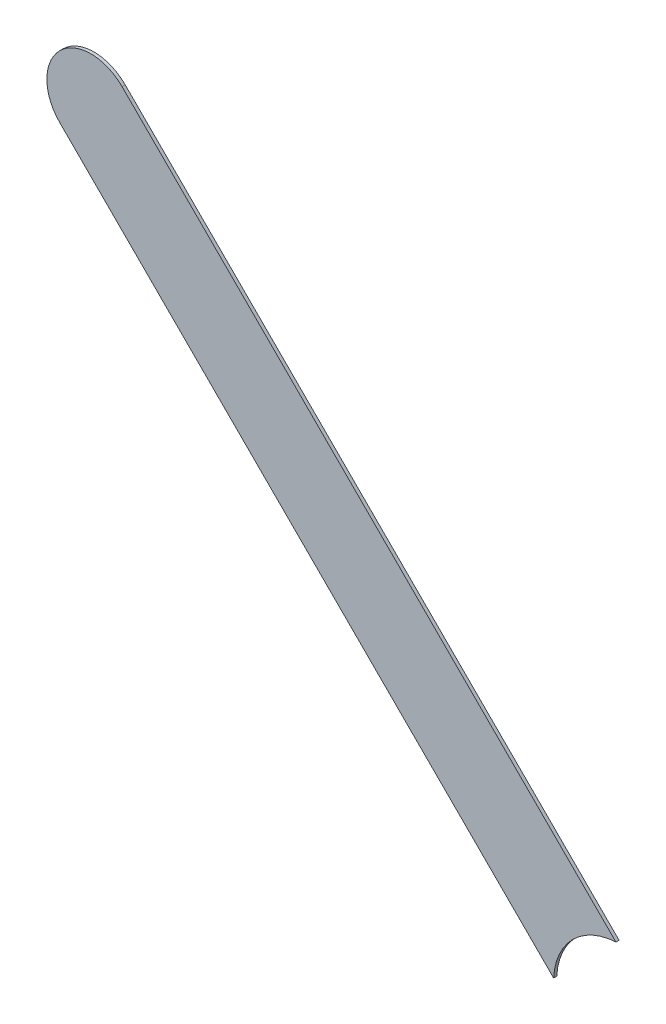
ISO-10303-21;
HEADER;
FILE_DESCRIPTION(('STEP AP214'),'2;1');
FILE_NAME('part.step','',(''),(''),'','','');
FILE_SCHEMA(('AUTOMOTIVE_DESIGN { 1 0 10303 214 1 1 1 1 }'));
ENDSEC;
DATA;
#1=APPLICATION_CONTEXT('core data for automotive mechanical design processes');
#2=APPLICATION_PROTOCOL_DEFINITION('international standard','automotive_design',2000,#1);
#3=PRODUCT_CONTEXT('',#1,'mechanical');
#4=PRODUCT('Part','Part','',(#3));
#5=PRODUCT_RELATED_PRODUCT_CATEGORY('part','',(#4));
#6=PRODUCT_DEFINITION_FORMATION('','',#4);
#7=PRODUCT_DEFINITION_CONTEXT('part definition',#1,'design');
#8=PRODUCT_DEFINITION('design','',#6,#7);
#9=PRODUCT_DEFINITION_SHAPE('','',#8);
#10=(LENGTH_UNIT() NAMED_UNIT(*) SI_UNIT(.MILLI.,.METRE.));
#11=(NAMED_UNIT(*) PLANE_ANGLE_UNIT() SI_UNIT($,.RADIAN.));
#12=(NAMED_UNIT(*) SI_UNIT($,.STERADIAN.) SOLID_ANGLE_UNIT());
#13=UNCERTAINTY_MEASURE_WITH_UNIT(LENGTH_MEASURE(1.E-05),#10,'distance_accuracy_value','');
#14=(GEOMETRIC_REPRESENTATION_CONTEXT(3) GLOBAL_UNCERTAINTY_ASSIGNED_CONTEXT((#13)) GLOBAL_UNIT_ASSIGNED_CONTEXT((#10,
#11,#12)) REPRESENTATION_CONTEXT('',''));
#15=CARTESIAN_POINT('',(0.,0.,0.));
#16=DIRECTION('',(0.,0.,1.));
#17=DIRECTION('',(1.,0.,0.));
#18=AXIS2_PLACEMENT_3D('',#15,#16,#17);
#19=CARTESIAN_POINT('',(71.46647124,48.14642644,0.));
#20=DIRECTION('',(0.707106781186548,0.707106781186548,0.));
#21=DIRECTION('',(0.707106781186548,-0.707106781186548,0.));
#22=AXIS2_PLACEMENT_3D('',#19,#20,#21);
#23=PLANE('',#22);
#24=DIRECTION('',(0.707106781186548,-0.707106781186548,0.));
#25=VECTOR('',#24,1.);
#26=CARTESIAN_POINT('',(71.46647124,48.14642644,0.03556));
#27=LINE('',#26,#25);
#28=CARTESIAN_POINT('',(71.46647124,48.14642644,0.03556));
#29=VERTEX_POINT('',#28);
#30=CARTESIAN_POINT('',(77.0711753914842,42.5417222885158,0.03556));
#31=VERTEX_POINT('',#30);
#32=EDGE_CURVE('E11',#29,#31,#27,.T.);
#33=ORIENTED_EDGE('',*,*,#32,.F.);
#34=DIRECTION('',(0.,0.,1.));
#35=VECTOR('',#34,1.);
#36=CARTESIAN_POINT('',(71.46647124,48.14642644,0.));
#37=LINE('',#36,#35);
#38=CARTESIAN_POINT('',(71.46647124,48.14642644,0.));
#39=VERTEX_POINT('',#38);
#40=EDGE_CURVE('E24',#39,#29,#37,.T.);
#41=ORIENTED_EDGE('',*,*,#40,.F.);
#42=DIRECTION('',(0.707106781186548,-0.707106781186548,0.));
#43=VECTOR('',#42,1.);
#44=CARTESIAN_POINT('',(71.46647124,48.14642644,0.));
#45=LINE('',#44,#43);
#46=CARTESIAN_POINT('',(77.0711753914842,42.5417222885158,0.));
#47=VERTEX_POINT('',#46);
#48=EDGE_CURVE('E75',#39,#47,#45,.T.);
#49=ORIENTED_EDGE('',*,*,#48,.T.);
#50=DIRECTION('',(0.,0.,1.));
#51=VECTOR('',#50,1.);
#52=CARTESIAN_POINT('',(77.0711753914842,42.5417222885158,0.));
#53=LINE('',#52,#51);
#54=EDGE_CURVE('E37',#47,#31,#53,.T.);
#55=ORIENTED_EDGE('',*,*,#54,.T.);
#56=EDGE_LOOP('',(#33,#41,#49,#55));
#57=FACE_BOUND('',#56,.T.);
#58=ADVANCED_FACE('F17',(#57),#23,.F.);
#59=CARTESIAN_POINT('',(77.820012,42.4999912,0.));
#60=DIRECTION('',(0.,0.,-1.));
#61=DIRECTION('',(1.,0.,0.));
#62=AXIS2_PLACEMENT_3D('',#59,#60,#61);
#63=CYLINDRICAL_SURFACE('',#62,0.7499985);
#64=DIRECTION('',(0.,0.,1.));
#65=VECTOR('',#64,1.);
#66=CARTESIAN_POINT('',(77.7782809114842,43.2488278085159,0.));
#67=LINE('',#66,#65);
#68=CARTESIAN_POINT('',(77.7782809114842,43.2488278085159,0.));
#69=VERTEX_POINT('',#68);
#70=CARTESIAN_POINT('',(77.7782809114842,43.2488278085159,0.03556));
#71=VERTEX_POINT('',#70);
#72=EDGE_CURVE('E67',#69,#71,#67,.T.);
#73=ORIENTED_EDGE('',*,*,#72,.T.);
#74=CARTESIAN_POINT('',(77.820012,42.4999912,0.03556));
#75=DIRECTION('',(0.,0.,1.));
#76=DIRECTION('',(1.,0.,0.));
#77=AXIS2_PLACEMENT_3D('',#74,#75,#76);
#78=CIRCLE('',#77,0.7499985);
#79=EDGE_CURVE('E82',#71,#31,#78,.T.);
#80=ORIENTED_EDGE('',*,*,#79,.T.);
#81=ORIENTED_EDGE('',*,*,#54,.F.);
#82=CARTESIAN_POINT('',(77.820012,42.4999912,0.));
#83=DIRECTION('',(0.,0.,1.));
#84=DIRECTION('',(1.,0.,0.));
#85=AXIS2_PLACEMENT_3D('',#82,#83,#84);
#86=CIRCLE('',#85,0.7499985);
#87=EDGE_CURVE('E80',#69,#47,#86,.T.);
#88=ORIENTED_EDGE('',*,*,#87,.F.);
#89=EDGE_LOOP('',(#73,#80,#81,#88));
#90=FACE_BOUND('',#89,.T.);
#91=ADVANCED_FACE('F88',(#90),#63,.F.);
#92=CARTESIAN_POINT('',(77.7782809114842,43.2488278085158,0.));
#93=DIRECTION('',(-0.707106781186548,-0.707106781186548,0.));
#94=DIRECTION('',(-0.707106781186548,0.707106781186548,0.));
#95=AXIS2_PLACEMENT_3D('',#92,#93,#94);
#96=PLANE('',#95);
#97=DIRECTION('',(-0.707106781186548,0.707106781186548,0.));
#98=VECTOR('',#97,1.);
#99=CARTESIAN_POINT('',(78.17356476,42.85354396,0.03556));
#100=LINE('',#99,#98);
#101=CARTESIAN_POINT('',(72.17357676,48.85353196,0.03556));
#102=VERTEX_POINT('',#101);
#103=EDGE_CURVE('E71',#71,#102,#100,.T.);
#104=ORIENTED_EDGE('',*,*,#103,.F.);
#105=ORIENTED_EDGE('',*,*,#72,.F.);
#106=DIRECTION('',(-0.707106781186548,0.707106781186548,0.));
#107=VECTOR('',#106,1.);
#108=CARTESIAN_POINT('',(78.17356476,42.85354396,0.));
#109=LINE('',#108,#107);
#110=CARTESIAN_POINT('',(72.17357676,48.85353196,0.));
#111=VERTEX_POINT('',#110);
#112=EDGE_CURVE('E63',#69,#111,#109,.T.);
#113=ORIENTED_EDGE('',*,*,#112,.T.);
#114=DIRECTION('',(0.,0.,1.));
#115=VECTOR('',#114,1.);
#116=CARTESIAN_POINT('',(72.17357676,48.85353196,0.));
#117=LINE('',#116,#115);
#118=EDGE_CURVE('E53',#111,#102,#117,.T.);
#119=ORIENTED_EDGE('',*,*,#118,.T.);
#120=EDGE_LOOP('',(#104,#105,#113,#119));
#121=FACE_BOUND('',#120,.T.);
#122=ADVANCED_FACE('F66',(#121),#96,.F.);
#123=CARTESIAN_POINT('',(71.820024,48.4999792,0.));
#124=DIRECTION('',(0.,0.,-1.));
#125=DIRECTION('',(0.707106781186562,0.707106781186533,0.));
#126=AXIS2_PLACEMENT_3D('',#123,#124,#125);
#127=CYLINDRICAL_SURFACE('',#126,0.499999108206443);
#128=CARTESIAN_POINT('',(71.820024,48.4999792,0.03556));
#129=DIRECTION('',(0.,0.,1.));
#130=DIRECTION('',(0.707106781186562,0.707106781186533,0.));
#131=AXIS2_PLACEMENT_3D('',#128,#129,#130);
#132=CIRCLE('',#131,0.499999108206443);
#133=EDGE_CURVE('E59',#102,#29,#132,.T.);
#134=ORIENTED_EDGE('',*,*,#133,.F.);
#135=ORIENTED_EDGE('',*,*,#118,.F.);
#136=CARTESIAN_POINT('',(71.820024,48.4999792,0.));
#137=DIRECTION('',(0.,0.,1.));
#138=DIRECTION('',(0.707106781186562,0.707106781186533,0.));
#139=AXIS2_PLACEMENT_3D('',#136,#137,#138);
#140=CIRCLE('',#139,0.499999108206443);
#141=EDGE_CURVE('E57',#111,#39,#140,.T.);
#142=ORIENTED_EDGE('',*,*,#141,.T.);
#143=ORIENTED_EDGE('',*,*,#40,.T.);
#144=EDGE_LOOP('',(#134,#135,#142,#143));
#145=FACE_BOUND('',#144,.T.);
#146=ADVANCED_FACE('F55',(#145),#127,.T.);
#147=CARTESIAN_POINT('',(71.46647124,48.14642644,0.));
#148=DIRECTION('',(0.,0.,-1.));
#149=DIRECTION('',(-1.,0.,0.));
#150=AXIS2_PLACEMENT_3D('',#147,#148,#149);
#151=PLANE('',#150);
#152=ORIENTED_EDGE('',*,*,#48,.F.);
#153=ORIENTED_EDGE('',*,*,#141,.F.);
#154=ORIENTED_EDGE('',*,*,#112,.F.);
#155=ORIENTED_EDGE('',*,*,#87,.T.);
#156=EDGE_LOOP('',(#152,#153,#154,#155));
#157=FACE_BOUND('',#156,.T.);
#158=ADVANCED_FACE('F74',(#157),#151,.T.);
#159=CARTESIAN_POINT('',(71.46647124,48.14642644,0.03556));
#160=DIRECTION('',(0.,0.,-1.));
#161=DIRECTION('',(-1.,0.,0.));
#162=AXIS2_PLACEMENT_3D('',#159,#160,#161);
#163=PLANE('',#162);
#164=ORIENTED_EDGE('',*,*,#133,.T.);
#165=ORIENTED_EDGE('',*,*,#32,.T.);
#166=ORIENTED_EDGE('',*,*,#79,.F.);
#167=ORIENTED_EDGE('',*,*,#103,.T.);
#168=EDGE_LOOP('',(#164,#165,#166,#167));
#169=FACE_BOUND('',#168,.T.);
#170=ADVANCED_FACE('F91',(#169),#163,.F.);
#171=CLOSED_SHELL('',(#58,#91,#122,#146,#158,#170));
#172=MANIFOLD_SOLID_BREP('B1',#171);
#173=ADVANCED_BREP_SHAPE_REPRESENTATION('',(#18,#172),#14);
#174=SHAPE_DEFINITION_REPRESENTATION(#9,#173);
ENDSEC;
END-ISO-10303-21;
